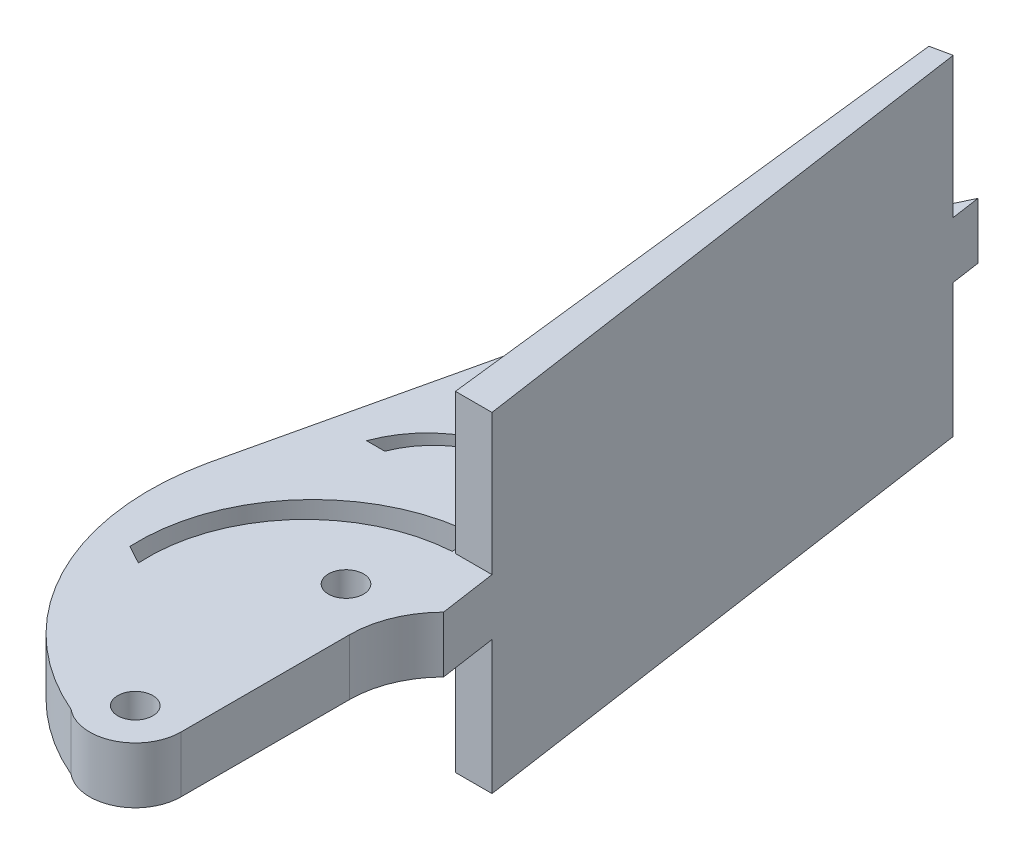
ISO-10303-21;
HEADER;
FILE_DESCRIPTION(('STEP AP214'),'2;1');
FILE_NAME('part.step','',(''),(''),'','','');
FILE_SCHEMA(('AUTOMOTIVE_DESIGN { 1 0 10303 214 1 1 1 1 }'));
ENDSEC;
DATA;
#1=APPLICATION_CONTEXT('core data for automotive mechanical design processes');
#2=APPLICATION_PROTOCOL_DEFINITION('international standard','automotive_design',2000,#1);
#3=PRODUCT_CONTEXT('',#1,'mechanical');
#4=PRODUCT('Part','Part','',(#3));
#5=PRODUCT_RELATED_PRODUCT_CATEGORY('part','',(#4));
#6=PRODUCT_DEFINITION_FORMATION('','',#4);
#7=PRODUCT_DEFINITION_CONTEXT('part definition',#1,'design');
#8=PRODUCT_DEFINITION('design','',#6,#7);
#9=PRODUCT_DEFINITION_SHAPE('','',#8);
#10=(LENGTH_UNIT() NAMED_UNIT(*) SI_UNIT(.MILLI.,.METRE.));
#11=(NAMED_UNIT(*) PLANE_ANGLE_UNIT() SI_UNIT($,.RADIAN.));
#12=(NAMED_UNIT(*) SI_UNIT($,.STERADIAN.) SOLID_ANGLE_UNIT());
#13=UNCERTAINTY_MEASURE_WITH_UNIT(LENGTH_MEASURE(1.E-05),#10,'distance_accuracy_value','');
#14=(GEOMETRIC_REPRESENTATION_CONTEXT(3) GLOBAL_UNCERTAINTY_ASSIGNED_CONTEXT((#13)) GLOBAL_UNIT_ASSIGNED_CONTEXT((#10,
#11,#12)) REPRESENTATION_CONTEXT('',''));
#15=CARTESIAN_POINT('',(0.,0.,0.));
#16=DIRECTION('',(0.,0.,1.));
#17=DIRECTION('',(1.,0.,0.));
#18=AXIS2_PLACEMENT_3D('',#15,#16,#17);
#19=CARTESIAN_POINT('',(0.,8.,0.));
#20=DIRECTION('',(0.,1.,0.));
#21=DIRECTION('',(0.,0.,1.));
#22=AXIS2_PLACEMENT_3D('',#19,#20,#21);
#23=PLANE('',#22);
#24=DIRECTION('',(-0.978459554748737,0.,0.206438610053701));
#25=VECTOR('',#24,1.);
#26=CARTESIAN_POINT('',(-24.0015502182052,8.,-113.760435287156));
#27=LINE('',#26,#25);
#28=CARTESIAN_POINT('',(-1.96303717669751,8.,-118.41019314159));
#29=VERTEX_POINT('',#28);
#30=CARTESIAN_POINT('',(-4.81941772703187,8.,-117.807544592926));
#31=VERTEX_POINT('',#30);
#32=EDGE_CURVE('E282',#29,#31,#27,.T.);
#33=ORIENTED_EDGE('',*,*,#32,.F.);
#34=DIRECTION('',(-0.144149943220239,0.,-0.989555856871961));
#35=VECTOR('',#34,1.);
#36=CARTESIAN_POINT('',(10.4081466808244,8.,-33.4848912706989));
#37=LINE('',#36,#35);
#38=CARTESIAN_POINT('',(-2.56534820899716,8.,-122.544918389175));
#39=VERTEX_POINT('',#38);
#40=EDGE_CURVE('E414',#29,#39,#37,.T.);
#41=ORIENTED_EDGE('',*,*,#40,.T.);
#42=DIRECTION('',(-0.429650341746804,0.,0.902995339875491));
#43=VECTOR('',#42,1.);
#44=CARTESIAN_POINT('',(-6.50000000000001,8.,-114.275467894005));
#45=LINE('',#44,#43);
#46=EDGE_CURVE('E419',#39,#31,#45,.T.);
#47=ORIENTED_EDGE('',*,*,#46,.T.);
#48=EDGE_LOOP('',(#33,#41,#47));
#49=FACE_BOUND('',#48,.T.);
#50=ADVANCED_FACE('F35',(#49),#23,.T.);
#51=CARTESIAN_POINT('',(0.,0.,0.));
#52=DIRECTION('',(0.,1.,0.));
#53=DIRECTION('',(0.,0.,1.));
#54=AXIS2_PLACEMENT_3D('',#51,#52,#53);
#55=PLANE('',#54);
#56=DIRECTION('',(-0.144149943220239,0.,-0.989555856871961));
#57=VECTOR('',#56,1.);
#58=CARTESIAN_POINT('',(10.4081466808244,0.,-33.4848912706989));
#59=LINE('',#58,#57);
#60=CARTESIAN_POINT('',(-1.96303717669751,0.,-118.41019314159));
#61=VERTEX_POINT('',#60);
#62=CARTESIAN_POINT('',(-2.56534820899716,0.,-122.544918389175));
#63=VERTEX_POINT('',#62);
#64=EDGE_CURVE('E428',#61,#63,#59,.T.);
#65=ORIENTED_EDGE('',*,*,#64,.F.);
#66=DIRECTION('',(-0.978459554748737,0.,0.206438610053701));
#67=VECTOR('',#66,1.);
#68=CARTESIAN_POINT('',(-24.0015502182052,0.,-113.760435287156));
#69=LINE('',#68,#67);
#70=CARTESIAN_POINT('',(-4.81941772703187,0.,-117.807544592926));
#71=VERTEX_POINT('',#70);
#72=EDGE_CURVE('E279',#61,#71,#69,.T.);
#73=ORIENTED_EDGE('',*,*,#72,.T.);
#74=DIRECTION('',(-0.429650341746804,0.,0.902995339875491));
#75=VECTOR('',#74,1.);
#76=CARTESIAN_POINT('',(-6.50000000000001,0.,-114.275467894005));
#77=LINE('',#76,#75);
#78=EDGE_CURVE('E410',#63,#71,#77,.T.);
#79=ORIENTED_EDGE('',*,*,#78,.F.);
#80=EDGE_LOOP('',(#65,#73,#79));
#81=FACE_BOUND('',#80,.T.);
#82=ADVANCED_FACE('F491',(#81),#55,.F.);
#83=DIRECTION('',(0.115307582744501,0.,0.993329835131121));
#84=VECTOR('',#83,1.);
#85=CARTESIAN_POINT('',(8.73815546155936,8.,-1.01434140834506));
#86=LINE('',#85,#84);
#87=CARTESIAN_POINT('',(-0.370262024287878,8.,-79.4798041660711));
#88=VERTEX_POINT('',#87);
#89=EDGE_CURVE('E50',#31,#88,#86,.T.);
#90=ORIENTED_EDGE('',*,*,#89,.F.);
#91=CARTESIAN_POINT('',(-6.50000000000001,8.,-114.275467894005));
#92=VERTEX_POINT('',#91);
#93=EDGE_CURVE('E418',#31,#92,#45,.T.);
#94=ORIENTED_EDGE('',*,*,#93,.T.);
#95=DIRECTION('',(0.224714099876424,0.,-0.97442473968836));
#96=VECTOR('',#95,1.);
#97=CARTESIAN_POINT('',(-31.1943271224295,8.,-7.19378814500271));
#98=LINE('',#97,#96);
#99=CARTESIAN_POINT('',(-24.7616449541148,8.,-35.0877416210196));
#100=VERTEX_POINT('',#99);
#101=EDGE_CURVE('E382',#100,#92,#98,.T.);
#102=ORIENTED_EDGE('',*,*,#101,.F.);
#103=CARTESIAN_POINT('',(9.87179029031433,8.,-27.5432388975849));
#104=DIRECTION('',(0.,-1.,0.));
#105=DIRECTION('',(0.,0.,-1.));
#106=AXIS2_PLACEMENT_3D('',#103,#104,#105);
#107=CIRCLE('',#106,35.4456535864975);
#108=CARTESIAN_POINT('',(-4.12894205869151,8.,5.02014317285557));
#109=VERTEX_POINT('',#108);
#110=EDGE_CURVE('E379',#109,#100,#107,.T.);
#111=ORIENTED_EDGE('',*,*,#110,.F.);
#112=CARTESIAN_POINT('',(0.,8.,0.));
#113=DIRECTION('',(0.,1.,0.));
#114=DIRECTION('',(0.,0.,1.));
#115=AXIS2_PLACEMENT_3D('',#112,#113,#114);
#116=CIRCLE('',#115,6.50000000000001);
#117=CARTESIAN_POINT('',(6.50000000000001,8.,0.));
#118=VERTEX_POINT('',#117);
#119=EDGE_CURVE('E407',#109,#118,#116,.T.);
#120=ORIENTED_EDGE('',*,*,#119,.T.);
#121=DIRECTION('',(0.,0.,-1.));
#122=VECTOR('',#121,1.);
#123=CARTESIAN_POINT('',(6.50000000000001,8.,0.));
#124=LINE('',#123,#122);
#125=CARTESIAN_POINT('',(6.50000000000001,8.,-24.));
#126=VERTEX_POINT('',#125);
#127=EDGE_CURVE('E409',#118,#126,#124,.T.);
#128=ORIENTED_EDGE('',*,*,#127,.T.);
#129=CARTESIAN_POINT('',(19.9637695934202,8.,-24.));
#130=DIRECTION('',(0.,-1.,0.));
#131=DIRECTION('',(0.,0.,1.));
#132=AXIS2_PLACEMENT_3D('',#129,#130,#131);
#133=CIRCLE('',#132,13.4637695934202);
#134=CARTESIAN_POINT('',(10.4081466808244,8.,-33.4848912706989));
#135=VERTEX_POINT('',#134);
#136=EDGE_CURVE('E412',#126,#135,#133,.T.);
#137=ORIENTED_EDGE('',*,*,#136,.T.);
#138=CARTESIAN_POINT('',(9.23319664539529,8.,-41.5506501819903));
#139=VERTEX_POINT('',#138);
#140=EDGE_CURVE('E415',#135,#139,#37,.T.);
#141=ORIENTED_EDGE('',*,*,#140,.T.);
#142=DIRECTION('',(1.,0.,0.));
#143=VECTOR('',#142,1.);
#144=CARTESIAN_POINT('',(0.,8.,-41.5506501819903));
#145=LINE('',#144,#143);
#146=CARTESIAN_POINT('',(4.0326250196425,8.,-41.5506501819903));
#147=VERTEX_POINT('',#146);
#148=EDGE_CURVE('E285',#147,#139,#145,.T.);
#149=ORIENTED_EDGE('',*,*,#148,.F.);
#150=CARTESIAN_POINT('',(0.,8.,-76.2901412940625));
#151=VERTEX_POINT('',#150);
#152=EDGE_CURVE('E276',#151,#147,#86,.T.);
#153=ORIENTED_EDGE('',*,*,#152,.F.);
#154=DIRECTION('',(0.,0.,1.));
#155=VECTOR('',#154,1.);
#156=CARTESIAN_POINT('',(0.,8.,-76.0414835697318));
#157=LINE('',#156,#155);
#158=CARTESIAN_POINT('',(0.,8.,-76.0414835697318));
#159=VERTEX_POINT('',#158);
#160=EDGE_CURVE('E296',#151,#159,#157,.T.);
#161=ORIENTED_EDGE('',*,*,#160,.T.);
#162=CARTESIAN_POINT('',(-2.60982967736821,8.,-67.2837094702245));
#163=DIRECTION('',(0.,1.,0.));
#164=DIRECTION('',(0.,0.,-1.));
#165=AXIS2_PLACEMENT_3D('',#162,#163,#164);
#166=CIRCLE('',#165,9.13837064923901);
#167=CARTESIAN_POINT('',(-11.3676037768755,8.,-69.8935391475928));
#168=VERTEX_POINT('',#167);
#169=EDGE_CURVE('E288',#159,#168,#166,.T.);
#170=ORIENTED_EDGE('',*,*,#169,.T.);
#171=DIRECTION('',(-0.889224485625051,0.,-0.457471107464574));
#172=VECTOR('',#171,1.);
#173=CARTESIAN_POINT('',(-11.3676037768755,8.,-69.8935391475928));
#174=LINE('',#173,#172);
#175=CARTESIAN_POINT('',(-13.0754520671843,8.,-70.7721600823277));
#176=VERTEX_POINT('',#175);
#177=EDGE_CURVE('E291',#168,#176,#174,.T.);
#178=ORIENTED_EDGE('',*,*,#177,.T.);
#179=CARTESIAN_POINT('',(-2.21846596166484,8.,-68.5536941206628));
#180=DIRECTION('',(0.,-1.,0.));
#181=DIRECTION('',(0.,0.,-1.));
#182=AXIS2_PLACEMENT_3D('',#179,#180,#181);
#183=CIRCLE('',#182,11.0813238612771);
#184=EDGE_CURVE('E56',#176,#88,#183,.T.);
#185=ORIENTED_EDGE('',*,*,#184,.T.);
#186=EDGE_LOOP('',(#90,#94,#102,#111,#120,#128,#137,#141,#149,#153,#161,#170,#178,#185));
#187=FACE_BOUND('',#186,.T.);
#188=CARTESIAN_POINT('',(-2.73478557009453,8.,-44.2838354653965));
#189=DIRECTION('',(0.,-1.,0.));
#190=DIRECTION('',(0.,0.,-1.));
#191=AXIS2_PLACEMENT_3D('',#188,#189,#190);
#192=CIRCLE('',#191,14.3185885992343);
#193=CARTESIAN_POINT('',(-16.2069395500168,8.,-49.1338918171706));
#194=VERTEX_POINT('',#193);
#195=CARTESIAN_POINT('',(2.11527078167961,8.,-57.7559894453188));
#196=VERTEX_POINT('',#195);
#197=EDGE_CURVE('E315',#194,#196,#192,.T.);
#198=ORIENTED_EDGE('',*,*,#197,.T.);
#199=DIRECTION('',(0.,0.,1.));
#200=VECTOR('',#199,1.);
#201=CARTESIAN_POINT('',(2.11527078167961,8.,-56.050896344864));
#202=LINE('',#201,#200);
#203=CARTESIAN_POINT('',(2.11527078167961,8.,-56.050896344864));
#204=VERTEX_POINT('',#203);
#205=EDGE_CURVE('E318',#196,#204,#202,.T.);
#206=ORIENTED_EDGE('',*,*,#205,.T.);
#207=CARTESIAN_POINT('',(-2.29245609918748,8.,-44.7261649363035));
#208=DIRECTION('',(0.,1.,0.));
#209=DIRECTION('',(0.,0.,-1.));
#210=AXIS2_PLACEMENT_3D('',#207,#208,#209);
#211=CIRCLE('',#210,12.1522671848654);
#212=CARTESIAN_POINT('',(-13.617187507748,8.,-49.1338918171706));
#213=VERTEX_POINT('',#212);
#214=EDGE_CURVE('E322',#204,#213,#211,.T.);
#215=ORIENTED_EDGE('',*,*,#214,.T.);
#216=DIRECTION('',(-1.,0.,0.));
#217=VECTOR('',#216,1.);
#218=CARTESIAN_POINT('',(-13.617187507748,8.,-49.1338918171706));
#219=LINE('',#218,#217);
#220=EDGE_CURVE('E325',#213,#194,#219,.T.);
#221=ORIENTED_EDGE('',*,*,#220,.T.);
#222=EDGE_LOOP('',(#198,#206,#215,#221));
#223=FACE_BOUND('',#222,.T.);
#224=CARTESIAN_POINT('',(4.96378659570352,8.,-19.2513719507803));
#225=DIRECTION('',(0.,1.,0.));
#226=DIRECTION('',(0.,0.,-1.));
#227=AXIS2_PLACEMENT_3D('',#224,#225,#226);
#228=CIRCLE('',#227,22.3800941443473);
#229=CARTESIAN_POINT('',(3.52847947186341,8.,-41.585393249465));
#230=VERTEX_POINT('',#229);
#231=CARTESIAN_POINT('',(-17.3702347029812,8.,-17.8160648269405));
#232=VERTEX_POINT('',#231);
#233=EDGE_CURVE('E347',#230,#232,#228,.T.);
#234=ORIENTED_EDGE('',*,*,#233,.T.);
#235=DIRECTION('',(-0.879505566908424,0.,-0.475888598074268));
#236=VECTOR('',#235,1.);
#237=CARTESIAN_POINT('',(-17.3702347029812,8.,-17.8160648269405));
#238=LINE('',#237,#236);
#239=CARTESIAN_POINT('',(-20.0228735994556,8.,-19.2513719507803));
#240=VERTEX_POINT('',#239);
#241=EDGE_CURVE('E350',#232,#240,#238,.T.);
#242=ORIENTED_EDGE('',*,*,#241,.T.);
#243=CARTESIAN_POINT('',(4.78114441918071,8.,-20.5040368980973));
#244=DIRECTION('',(0.,-1.,0.));
#245=DIRECTION('',(0.,0.,-1.));
#246=AXIS2_PLACEMENT_3D('',#243,#244,#245);
#247=CIRCLE('',#246,24.8356292317926);
#248=CARTESIAN_POINT('',(3.5284794718634,8.,-45.3080549167336));
#249=VERTEX_POINT('',#248);
#250=EDGE_CURVE('E354',#240,#249,#247,.T.);
#251=ORIENTED_EDGE('',*,*,#250,.T.);
#252=DIRECTION('',(0.,0.,1.));
#253=VECTOR('',#252,1.);
#254=CARTESIAN_POINT('',(3.52847947186341,8.,-41.585393249465));
#255=LINE('',#254,#253);
#256=EDGE_CURVE('E357',#249,#230,#255,.T.);
#257=ORIENTED_EDGE('',*,*,#256,.T.);
#258=EDGE_LOOP('',(#234,#242,#251,#257));
#259=FACE_BOUND('',#258,.T.);
#260=CARTESIAN_POINT('',(0.,8.,0.));
#261=DIRECTION('',(0.,1.,0.));
#262=DIRECTION('',(0.,0.,1.));
#263=AXIS2_PLACEMENT_3D('',#260,#261,#262);
#264=CIRCLE('',#263,2.5);
#265=CARTESIAN_POINT('',(0.,8.,2.5));
#266=VERTEX_POINT('',#265);
#267=EDGE_CURVE('E401',#266,#266,#264,.T.);
#268=ORIENTED_EDGE('',*,*,#267,.F.);
#269=EDGE_LOOP('',(#268));
#270=FACE_BOUND('',#269,.T.);
#271=CARTESIAN_POINT('',(0.,8.,-30.));
#272=DIRECTION('',(0.,1.,0.));
#273=DIRECTION('',(0.,0.,1.));
#274=AXIS2_PLACEMENT_3D('',#271,#272,#273);
#275=CIRCLE('',#274,2.5);
#276=CARTESIAN_POINT('',(0.,8.,-27.5));
#277=VERTEX_POINT('',#276);
#278=EDGE_CURVE('E395',#277,#277,#275,.T.);
#279=ORIENTED_EDGE('',*,*,#278,.F.);
#280=EDGE_LOOP('',(#279));
#281=FACE_BOUND('',#280,.T.);
#282=ADVANCED_FACE('F471',(#187,#223,#259,#270,#281),#23,.T.);
#283=CARTESIAN_POINT('',(-6.50000000000001,0.,-114.275467894005));
#284=VERTEX_POINT('',#283);
#285=EDGE_CURVE('E432',#71,#284,#77,.T.);
#286=ORIENTED_EDGE('',*,*,#285,.F.);
#287=DIRECTION('',(0.115307582744501,0.,0.993329835131121));
#288=VECTOR('',#287,1.);
#289=CARTESIAN_POINT('',(8.73815546155936,0.,-1.01434140834506));
#290=LINE('',#289,#288);
#291=CARTESIAN_POINT('',(-0.370262024287878,0.,-79.4798041660711));
#292=VERTEX_POINT('',#291);
#293=EDGE_CURVE('E263',#71,#292,#290,.T.);
#294=ORIENTED_EDGE('',*,*,#293,.T.);
#295=CARTESIAN_POINT('',(-2.21846596166484,0.,-68.5536941206628));
#296=DIRECTION('',(0.,-1.,0.));
#297=DIRECTION('',(0.,0.,-1.));
#298=AXIS2_PLACEMENT_3D('',#295,#296,#297);
#299=CIRCLE('',#298,11.0813238612771);
#300=CARTESIAN_POINT('',(-13.0754520671843,0.,-70.7721600823277));
#301=VERTEX_POINT('',#300);
#302=EDGE_CURVE('E303',#301,#292,#299,.T.);
#303=ORIENTED_EDGE('',*,*,#302,.F.);
#304=DIRECTION('',(-0.889224485625051,0.,-0.457471107464574));
#305=VECTOR('',#304,1.);
#306=CARTESIAN_POINT('',(-11.3676037768755,0.,-69.8935391475928));
#307=LINE('',#306,#305);
#308=CARTESIAN_POINT('',(-11.3676037768755,0.,-69.8935391475928));
#309=VERTEX_POINT('',#308);
#310=EDGE_CURVE('E300',#309,#301,#307,.T.);
#311=ORIENTED_EDGE('',*,*,#310,.F.);
#312=CARTESIAN_POINT('',(-2.60982967736821,0.,-67.2837094702245));
#313=DIRECTION('',(0.,1.,0.));
#314=DIRECTION('',(0.,0.,-1.));
#315=AXIS2_PLACEMENT_3D('',#312,#313,#314);
#316=CIRCLE('',#315,9.13837064923901);
#317=CARTESIAN_POINT('',(0.,0.,-76.0414835697318));
#318=VERTEX_POINT('',#317);
#319=EDGE_CURVE('E287',#318,#309,#316,.T.);
#320=ORIENTED_EDGE('',*,*,#319,.F.);
#321=DIRECTION('',(0.,0.,1.));
#322=VECTOR('',#321,1.);
#323=CARTESIAN_POINT('',(0.,0.,-76.0414835697318));
#324=LINE('',#323,#322);
#325=CARTESIAN_POINT('',(0.,0.,-76.2901412940625));
#326=VERTEX_POINT('',#325);
#327=EDGE_CURVE('E292',#326,#318,#324,.T.);
#328=ORIENTED_EDGE('',*,*,#327,.F.);
#329=CARTESIAN_POINT('',(4.0326250196425,0.,-41.5506501819903));
#330=VERTEX_POINT('',#329);
#331=EDGE_CURVE('E273',#326,#330,#290,.T.);
#332=ORIENTED_EDGE('',*,*,#331,.T.);
#333=DIRECTION('',(1.,0.,0.));
#334=VECTOR('',#333,1.);
#335=CARTESIAN_POINT('',(0.,0.,-41.5506501819903));
#336=LINE('',#335,#334);
#337=CARTESIAN_POINT('',(9.23319664539529,0.,-41.5506501819903));
#338=VERTEX_POINT('',#337);
#339=EDGE_CURVE('E226',#330,#338,#336,.T.);
#340=ORIENTED_EDGE('',*,*,#339,.T.);
#341=CARTESIAN_POINT('',(10.4081466808244,0.,-33.4848912706989));
#342=VERTEX_POINT('',#341);
#343=EDGE_CURVE('E429',#342,#338,#59,.T.);
#344=ORIENTED_EDGE('',*,*,#343,.F.);
#345=CARTESIAN_POINT('',(19.9637695934202,0.,-24.));
#346=DIRECTION('',(0.,-1.,0.));
#347=DIRECTION('',(0.,0.,1.));
#348=AXIS2_PLACEMENT_3D('',#345,#346,#347);
#349=CIRCLE('',#348,13.4637695934202);
#350=CARTESIAN_POINT('',(6.50000000000001,0.,-24.));
#351=VERTEX_POINT('',#350);
#352=EDGE_CURVE('E426',#351,#342,#349,.T.);
#353=ORIENTED_EDGE('',*,*,#352,.F.);
#354=DIRECTION('',(0.,0.,-1.));
#355=VECTOR('',#354,1.);
#356=CARTESIAN_POINT('',(6.50000000000001,0.,0.));
#357=LINE('',#356,#355);
#358=CARTESIAN_POINT('',(6.50000000000001,0.,0.));
#359=VERTEX_POINT('',#358);
#360=EDGE_CURVE('E424',#359,#351,#357,.T.);
#361=ORIENTED_EDGE('',*,*,#360,.F.);
#362=CARTESIAN_POINT('',(0.,0.,0.));
#363=DIRECTION('',(0.,1.,0.));
#364=DIRECTION('',(0.,0.,1.));
#365=AXIS2_PLACEMENT_3D('',#362,#363,#364);
#366=CIRCLE('',#365,6.50000000000001);
#367=CARTESIAN_POINT('',(-4.12894205869151,0.,5.02014317285557));
#368=VERTEX_POINT('',#367);
#369=EDGE_CURVE('E404',#368,#359,#366,.T.);
#370=ORIENTED_EDGE('',*,*,#369,.F.);
#371=CARTESIAN_POINT('',(9.87179029031433,0.,-27.5432388975849));
#372=DIRECTION('',(0.,-1.,0.));
#373=DIRECTION('',(0.,0.,-1.));
#374=AXIS2_PLACEMENT_3D('',#371,#372,#373);
#375=CIRCLE('',#374,35.4456535864975);
#376=CARTESIAN_POINT('',(-24.7616449541148,0.,-35.0877416210196));
#377=VERTEX_POINT('',#376);
#378=EDGE_CURVE('E372',#368,#377,#375,.T.);
#379=ORIENTED_EDGE('',*,*,#378,.T.);
#380=DIRECTION('',(0.224714099876424,0.,-0.97442473968836));
#381=VECTOR('',#380,1.);
#382=CARTESIAN_POINT('',(-31.1943271224295,0.,-7.19378814500271));
#383=LINE('',#382,#381);
#384=EDGE_CURVE('E383',#377,#284,#383,.T.);
#385=ORIENTED_EDGE('',*,*,#384,.T.);
#386=EDGE_LOOP('',(#286,#294,#303,#311,#320,#328,#332,#340,#344,#353,#361,#370,#379,#385));
#387=FACE_BOUND('',#386,.T.);
#388=DIRECTION('',(0.,0.,1.));
#389=VECTOR('',#388,1.);
#390=CARTESIAN_POINT('',(2.11527078167961,0.,-56.050896344864));
#391=LINE('',#390,#389);
#392=CARTESIAN_POINT('',(2.11527078167961,0.,-57.7559894453188));
#393=VERTEX_POINT('',#392);
#394=CARTESIAN_POINT('',(2.11527078167961,0.,-56.050896344864));
#395=VERTEX_POINT('',#394);
#396=EDGE_CURVE('E330',#393,#395,#391,.T.);
#397=ORIENTED_EDGE('',*,*,#396,.F.);
#398=CARTESIAN_POINT('',(-2.73478557009453,0.,-44.2838354653965));
#399=DIRECTION('',(0.,-1.,0.));
#400=DIRECTION('',(0.,0.,-1.));
#401=AXIS2_PLACEMENT_3D('',#398,#399,#400);
#402=CIRCLE('',#401,14.3185885992343);
#403=CARTESIAN_POINT('',(-16.2069395500168,0.,-49.1338918171706));
#404=VERTEX_POINT('',#403);
#405=EDGE_CURVE('E310',#404,#393,#402,.T.);
#406=ORIENTED_EDGE('',*,*,#405,.F.);
#407=DIRECTION('',(-1.,0.,0.));
#408=VECTOR('',#407,1.);
#409=CARTESIAN_POINT('',(-13.617187507748,0.,-49.1338918171706));
#410=LINE('',#409,#408);
#411=CARTESIAN_POINT('',(-13.617187507748,0.,-49.1338918171706));
#412=VERTEX_POINT('',#411);
#413=EDGE_CURVE('E319',#412,#404,#410,.T.);
#414=ORIENTED_EDGE('',*,*,#413,.F.);
#415=CARTESIAN_POINT('',(-2.29245609918748,0.,-44.7261649363035));
#416=DIRECTION('',(0.,1.,0.));
#417=DIRECTION('',(0.,0.,-1.));
#418=AXIS2_PLACEMENT_3D('',#415,#416,#417);
#419=CIRCLE('',#418,12.1522671848654);
#420=EDGE_CURVE('E333',#395,#412,#419,.T.);
#421=ORIENTED_EDGE('',*,*,#420,.F.);
#422=EDGE_LOOP('',(#397,#406,#414,#421));
#423=FACE_BOUND('',#422,.T.);
#424=DIRECTION('',(-0.879505566908424,0.,-0.475888598074268));
#425=VECTOR('',#424,1.);
#426=CARTESIAN_POINT('',(-17.3702347029812,0.,-17.8160648269405));
#427=LINE('',#426,#425);
#428=CARTESIAN_POINT('',(-17.3702347029812,0.,-17.8160648269405));
#429=VERTEX_POINT('',#428);
#430=CARTESIAN_POINT('',(-20.0228735994556,0.,-19.2513719507803));
#431=VERTEX_POINT('',#430);
#432=EDGE_CURVE('E362',#429,#431,#427,.T.);
#433=ORIENTED_EDGE('',*,*,#432,.F.);
#434=CARTESIAN_POINT('',(4.96378659570352,0.,-19.2513719507803));
#435=DIRECTION('',(0.,1.,0.));
#436=DIRECTION('',(0.,0.,-1.));
#437=AXIS2_PLACEMENT_3D('',#434,#435,#436);
#438=CIRCLE('',#437,22.3800941443473);
#439=CARTESIAN_POINT('',(3.52847947186341,0.,-41.585393249465));
#440=VERTEX_POINT('',#439);
#441=EDGE_CURVE('E340',#440,#429,#438,.T.);
#442=ORIENTED_EDGE('',*,*,#441,.F.);
#443=DIRECTION('',(0.,0.,1.));
#444=VECTOR('',#443,1.);
#445=CARTESIAN_POINT('',(3.52847947186341,0.,-41.585393249465));
#446=LINE('',#445,#444);
#447=CARTESIAN_POINT('',(3.5284794718634,0.,-45.3080549167336));
#448=VERTEX_POINT('',#447);
#449=EDGE_CURVE('E351',#448,#440,#446,.T.);
#450=ORIENTED_EDGE('',*,*,#449,.F.);
#451=CARTESIAN_POINT('',(4.78114441918071,0.,-20.5040368980973));
#452=DIRECTION('',(0.,-1.,0.));
#453=DIRECTION('',(0.,0.,-1.));
#454=AXIS2_PLACEMENT_3D('',#451,#452,#453);
#455=CIRCLE('',#454,24.8356292317926);
#456=EDGE_CURVE('E365',#431,#448,#455,.T.);
#457=ORIENTED_EDGE('',*,*,#456,.F.);
#458=EDGE_LOOP('',(#433,#442,#450,#457));
#459=FACE_BOUND('',#458,.T.);
#460=CARTESIAN_POINT('',(0.,0.,0.));
#461=DIRECTION('',(0.,1.,0.));
#462=DIRECTION('',(0.,0.,1.));
#463=AXIS2_PLACEMENT_3D('',#460,#461,#462);
#464=CIRCLE('',#463,2.5);
#465=CARTESIAN_POINT('',(0.,0.,2.5));
#466=VERTEX_POINT('',#465);
#467=EDGE_CURVE('E398',#466,#466,#464,.T.);
#468=ORIENTED_EDGE('',*,*,#467,.T.);
#469=EDGE_LOOP('',(#468));
#470=FACE_BOUND('',#469,.T.);
#471=CARTESIAN_POINT('',(0.,0.,-30.));
#472=DIRECTION('',(0.,1.,0.));
#473=DIRECTION('',(0.,0.,1.));
#474=AXIS2_PLACEMENT_3D('',#471,#472,#473);
#475=CIRCLE('',#474,2.5);
#476=CARTESIAN_POINT('',(0.,0.,-27.5));
#477=VERTEX_POINT('',#476);
#478=EDGE_CURVE('E393',#477,#477,#475,.T.);
#479=ORIENTED_EDGE('',*,*,#478,.T.);
#480=EDGE_LOOP('',(#479));
#481=FACE_BOUND('',#480,.T.);
#482=ADVANCED_FACE('F457',(#387,#423,#459,#470,#481),#55,.F.);
#483=CARTESIAN_POINT('',(0.,8.,0.));
#484=DIRECTION('',(0.,-1.,0.));
#485=DIRECTION('',(0.,0.,-1.));
#486=AXIS2_PLACEMENT_3D('',#483,#484,#485);
#487=CYLINDRICAL_SURFACE('',#486,6.50000000000001);
#488=ORIENTED_EDGE('',*,*,#119,.F.);
#489=DIRECTION('',(0.,-1.,0.));
#490=VECTOR('',#489,1.);
#491=CARTESIAN_POINT('',(-4.12894205869151,8.,5.02014317285557));
#492=LINE('',#491,#490);
#493=EDGE_CURVE('E386',#109,#368,#492,.T.);
#494=ORIENTED_EDGE('',*,*,#493,.T.);
#495=ORIENTED_EDGE('',*,*,#369,.T.);
#496=DIRECTION('',(0.,-1.,0.));
#497=VECTOR('',#496,1.);
#498=CARTESIAN_POINT('',(6.50000000000001,8.,0.));
#499=LINE('',#498,#497);
#500=EDGE_CURVE('E43',#118,#359,#499,.T.);
#501=ORIENTED_EDGE('',*,*,#500,.F.);
#502=EDGE_LOOP('',(#488,#494,#495,#501));
#503=FACE_BOUND('',#502,.T.);
#504=ADVANCED_FACE('F37',(#503),#487,.T.);
#505=CARTESIAN_POINT('',(6.50000000000001,8.,0.));
#506=DIRECTION('',(-1.,0.,0.));
#507=DIRECTION('',(0.,0.,1.));
#508=AXIS2_PLACEMENT_3D('',#505,#506,#507);
#509=PLANE('',#508);
#510=ORIENTED_EDGE('',*,*,#360,.T.);
#511=DIRECTION('',(0.,-1.,0.));
#512=VECTOR('',#511,1.);
#513=CARTESIAN_POINT('',(6.50000000000001,8.,-24.));
#514=LINE('',#513,#512);
#515=EDGE_CURVE('E443',#126,#351,#514,.T.);
#516=ORIENTED_EDGE('',*,*,#515,.F.);
#517=ORIENTED_EDGE('',*,*,#127,.F.);
#518=ORIENTED_EDGE('',*,*,#500,.T.);
#519=EDGE_LOOP('',(#510,#516,#517,#518));
#520=FACE_BOUND('',#519,.T.);
#521=ADVANCED_FACE('F450',(#520),#509,.F.);
#522=CARTESIAN_POINT('',(19.9637695934202,8.,-24.));
#523=DIRECTION('',(0.,-1.,0.));
#524=DIRECTION('',(0.,0.,-1.));
#525=AXIS2_PLACEMENT_3D('',#522,#523,#524);
#526=CYLINDRICAL_SURFACE('',#525,13.4637695934202);
#527=ORIENTED_EDGE('',*,*,#352,.T.);
#528=DIRECTION('',(0.,-1.,0.));
#529=VECTOR('',#528,1.);
#530=CARTESIAN_POINT('',(10.4081466808244,8.,-33.4848912706989));
#531=LINE('',#530,#529);
#532=EDGE_CURVE('E440',#135,#342,#531,.T.);
#533=ORIENTED_EDGE('',*,*,#532,.F.);
#534=ORIENTED_EDGE('',*,*,#136,.F.);
#535=ORIENTED_EDGE('',*,*,#515,.T.);
#536=EDGE_LOOP('',(#527,#533,#534,#535));
#537=FACE_BOUND('',#536,.T.);
#538=ADVANCED_FACE('F463',(#537),#526,.F.);
#539=CARTESIAN_POINT('',(10.4081466808244,8.,-33.4848912706989));
#540=DIRECTION('',(-0.989555856871961,0.,0.144149943220239));
#541=DIRECTION('',(0.144149943220239,0.,0.989555856871961));
#542=AXIS2_PLACEMENT_3D('',#539,#540,#541);
#543=PLANE('',#542);
#544=ORIENTED_EDGE('',*,*,#40,.F.);
#545=DIRECTION('',(0.,-1.,0.));
#546=VECTOR('',#545,1.);
#547=CARTESIAN_POINT('',(-1.96303717669751,28.,-118.41019314159));
#548=LINE('',#547,#546);
#549=CARTESIAN_POINT('',(-1.96303717669751,28.,-118.41019314159));
#550=VERTEX_POINT('',#549);
#551=EDGE_CURVE('E265',#550,#29,#548,.T.);
#552=ORIENTED_EDGE('',*,*,#551,.F.);
#553=DIRECTION('',(0.14414994322024,0.,0.989555856871961));
#554=VECTOR('',#553,1.);
#555=CARTESIAN_POINT('',(9.23319664539529,28.,-41.5506501819903));
#556=LINE('',#555,#554);
#557=CARTESIAN_POINT('',(9.23319664539529,28.,-41.5506501819903));
#558=VERTEX_POINT('',#557);
#559=EDGE_CURVE('E229',#550,#558,#556,.T.);
#560=ORIENTED_EDGE('',*,*,#559,.T.);
#561=DIRECTION('',(0.,-1.,0.));
#562=VECTOR('',#561,1.);
#563=CARTESIAN_POINT('',(9.23319664539529,28.,-41.5506501819903));
#564=LINE('',#563,#562);
#565=EDGE_CURVE('E260',#558,#139,#564,.T.);
#566=ORIENTED_EDGE('',*,*,#565,.T.);
#567=ORIENTED_EDGE('',*,*,#140,.F.);
#568=ORIENTED_EDGE('',*,*,#532,.T.);
#569=ORIENTED_EDGE('',*,*,#343,.T.);
#570=CARTESIAN_POINT('',(9.23319664539529,-19.,-41.5506501819903));
#571=VERTEX_POINT('',#570);
#572=EDGE_CURVE('E264',#338,#571,#564,.T.);
#573=ORIENTED_EDGE('',*,*,#572,.T.);
#574=DIRECTION('',(0.14414994322024,0.,0.989555856871961));
#575=VECTOR('',#574,1.);
#576=CARTESIAN_POINT('',(9.23319664539529,-19.,-41.5506501819903));
#577=LINE('',#576,#575);
#578=CARTESIAN_POINT('',(-1.96303717669751,-19.,-118.41019314159));
#579=VERTEX_POINT('',#578);
#580=EDGE_CURVE('E244',#579,#571,#577,.T.);
#581=ORIENTED_EDGE('',*,*,#580,.F.);
#582=EDGE_CURVE('E267',#61,#579,#548,.T.);
#583=ORIENTED_EDGE('',*,*,#582,.F.);
#584=ORIENTED_EDGE('',*,*,#64,.T.);
#585=DIRECTION('',(0.,-1.,0.));
#586=VECTOR('',#585,1.);
#587=CARTESIAN_POINT('',(-2.56534820899716,8.,-122.544918389175));
#588=LINE('',#587,#586);
#589=EDGE_CURVE('E437',#39,#63,#588,.T.);
#590=ORIENTED_EDGE('',*,*,#589,.F.);
#591=EDGE_LOOP('',(#544,#552,#560,#566,#567,#568,#569,#573,#581,#583,#584,#590));
#592=FACE_BOUND('',#591,.T.);
#593=ADVANCED_FACE('F468',(#592),#543,.F.);
#594=CARTESIAN_POINT('',(-6.50000000000001,8.,-114.275467894005));
#595=DIRECTION('',(0.902995339875491,0.,0.429650341746805));
#596=DIRECTION('',(0.429650341746805,0.,-0.902995339875491));
#597=AXIS2_PLACEMENT_3D('',#594,#595,#596);
#598=PLANE('',#597);
#599=ORIENTED_EDGE('',*,*,#93,.F.);
#600=ORIENTED_EDGE('',*,*,#46,.F.);
#601=ORIENTED_EDGE('',*,*,#589,.T.);
#602=ORIENTED_EDGE('',*,*,#78,.T.);
#603=ORIENTED_EDGE('',*,*,#285,.T.);
#604=DIRECTION('',(0.,-1.,0.));
#605=VECTOR('',#604,1.);
#606=CARTESIAN_POINT('',(-6.50000000000001,8.,-114.275467894005));
#607=LINE('',#606,#605);
#608=EDGE_CURVE('E422',#92,#284,#607,.T.);
#609=ORIENTED_EDGE('',*,*,#608,.F.);
#610=EDGE_LOOP('',(#599,#600,#601,#602,#603,#609));
#611=FACE_BOUND('',#610,.T.);
#612=ADVANCED_FACE('F485',(#611),#598,.F.);
#613=CARTESIAN_POINT('',(0.,8.,0.));
#614=DIRECTION('',(0.,-1.,0.));
#615=DIRECTION('',(0.,0.,-1.));
#616=AXIS2_PLACEMENT_3D('',#613,#614,#615);
#617=CYLINDRICAL_SURFACE('',#616,2.5);
#618=ORIENTED_EDGE('',*,*,#267,.T.);
#619=EDGE_LOOP('',(#618));
#620=FACE_BOUND('',#619,.T.);
#621=ORIENTED_EDGE('',*,*,#467,.F.);
#622=EDGE_LOOP('',(#621));
#623=FACE_BOUND('',#622,.T.);
#624=ADVANCED_FACE('F551',(#620,#623),#617,.F.);
#625=CARTESIAN_POINT('',(0.,8.,-30.));
#626=DIRECTION('',(0.,-1.,0.));
#627=DIRECTION('',(0.,0.,-1.));
#628=AXIS2_PLACEMENT_3D('',#625,#626,#627);
#629=CYLINDRICAL_SURFACE('',#628,2.5);
#630=ORIENTED_EDGE('',*,*,#278,.T.);
#631=EDGE_LOOP('',(#630));
#632=FACE_BOUND('',#631,.T.);
#633=ORIENTED_EDGE('',*,*,#478,.F.);
#634=EDGE_LOOP('',(#633));
#635=FACE_BOUND('',#634,.T.);
#636=ADVANCED_FACE('F579',(#632,#635),#629,.F.);
#637=CARTESIAN_POINT('',(-31.1943271224295,8.,-7.19378814500271));
#638=DIRECTION('',(-0.97442473968836,0.,-0.224714099876424));
#639=DIRECTION('',(-0.224714099876424,0.,0.97442473968836));
#640=AXIS2_PLACEMENT_3D('',#637,#638,#639);
#641=PLANE('',#640);
#642=ORIENTED_EDGE('',*,*,#384,.F.);
#643=DIRECTION('',(0.,-1.,0.));
#644=VECTOR('',#643,1.);
#645=CARTESIAN_POINT('',(-24.7616449541148,8.,-35.0877416210196));
#646=LINE('',#645,#644);
#647=EDGE_CURVE('E391',#100,#377,#646,.T.);
#648=ORIENTED_EDGE('',*,*,#647,.F.);
#649=ORIENTED_EDGE('',*,*,#101,.T.);
#650=ORIENTED_EDGE('',*,*,#608,.T.);
#651=EDGE_LOOP('',(#642,#648,#649,#650));
#652=FACE_BOUND('',#651,.T.);
#653=ADVANCED_FACE('F481',(#652),#641,.T.);
#654=CARTESIAN_POINT('',(9.87179029031433,8.,-27.5432388975849));
#655=DIRECTION('',(0.,-1.,0.));
#656=DIRECTION('',(0.,0.,-1.));
#657=AXIS2_PLACEMENT_3D('',#654,#655,#656);
#658=CYLINDRICAL_SURFACE('',#657,35.4456535864975);
#659=ORIENTED_EDGE('',*,*,#378,.F.);
#660=ORIENTED_EDGE('',*,*,#493,.F.);
#661=ORIENTED_EDGE('',*,*,#110,.T.);
#662=ORIENTED_EDGE('',*,*,#647,.T.);
#663=EDGE_LOOP('',(#659,#660,#661,#662));
#664=FACE_BOUND('',#663,.T.);
#665=ADVANCED_FACE('F478',(#664),#658,.T.);
#666=CARTESIAN_POINT('',(4.96378659570352,8.,-19.2513719507803));
#667=DIRECTION('',(0.,-1.,0.));
#668=DIRECTION('',(0.,0.,-1.));
#669=AXIS2_PLACEMENT_3D('',#666,#667,#668);
#670=CYLINDRICAL_SURFACE('',#669,22.3800941443473);
#671=ORIENTED_EDGE('',*,*,#441,.T.);
#672=DIRECTION('',(0.,-1.,0.));
#673=VECTOR('',#672,1.);
#674=CARTESIAN_POINT('',(-17.3702347029812,8.,-17.8160648269405));
#675=LINE('',#674,#673);
#676=EDGE_CURVE('E360',#232,#429,#675,.T.);
#677=ORIENTED_EDGE('',*,*,#676,.F.);
#678=ORIENTED_EDGE('',*,*,#233,.F.);
#679=DIRECTION('',(0.,-1.,0.));
#680=VECTOR('',#679,1.);
#681=CARTESIAN_POINT('',(3.52847947186341,8.,-41.585393249465));
#682=LINE('',#681,#680);
#683=EDGE_CURVE('E370',#230,#440,#682,.T.);
#684=ORIENTED_EDGE('',*,*,#683,.T.);
#685=EDGE_LOOP('',(#671,#677,#678,#684));
#686=FACE_BOUND('',#685,.T.);
#687=ADVANCED_FACE('F608',(#686),#670,.T.);
#688=CARTESIAN_POINT('',(3.52847947186341,8.,-41.585393249465));
#689=DIRECTION('',(1.,0.,0.));
#690=DIRECTION('',(0.,0.,-1.));
#691=AXIS2_PLACEMENT_3D('',#688,#689,#690);
#692=PLANE('',#691);
#693=ORIENTED_EDGE('',*,*,#449,.T.);
#694=ORIENTED_EDGE('',*,*,#683,.F.);
#695=ORIENTED_EDGE('',*,*,#256,.F.);
#696=DIRECTION('',(0.,-1.,0.));
#697=VECTOR('',#696,1.);
#698=CARTESIAN_POINT('',(3.5284794718634,8.,-45.3080549167336));
#699=LINE('',#698,#697);
#700=EDGE_CURVE('E373',#249,#448,#699,.T.);
#701=ORIENTED_EDGE('',*,*,#700,.T.);
#702=EDGE_LOOP('',(#693,#694,#695,#701));
#703=FACE_BOUND('',#702,.T.);
#704=ADVANCED_FACE('F615',(#703),#692,.F.);
#705=CARTESIAN_POINT('',(4.78114441918071,8.,-20.5040368980973));
#706=DIRECTION('',(0.,-1.,0.));
#707=DIRECTION('',(0.,0.,-1.));
#708=AXIS2_PLACEMENT_3D('',#705,#706,#707);
#709=CYLINDRICAL_SURFACE('',#708,24.8356292317926);
#710=ORIENTED_EDGE('',*,*,#456,.T.);
#711=ORIENTED_EDGE('',*,*,#700,.F.);
#712=ORIENTED_EDGE('',*,*,#250,.F.);
#713=DIRECTION('',(0.,-1.,0.));
#714=VECTOR('',#713,1.);
#715=CARTESIAN_POINT('',(-20.0228735994556,8.,-19.2513719507803));
#716=LINE('',#715,#714);
#717=EDGE_CURVE('E375',#240,#431,#716,.T.);
#718=ORIENTED_EDGE('',*,*,#717,.T.);
#719=EDGE_LOOP('',(#710,#711,#712,#718));
#720=FACE_BOUND('',#719,.T.);
#721=ADVANCED_FACE('F623',(#720),#709,.F.);
#722=CARTESIAN_POINT('',(-17.3702347029812,8.,-17.8160648269405));
#723=DIRECTION('',(-0.475888598074268,0.,0.879505566908424));
#724=DIRECTION('',(0.879505566908424,0.,0.475888598074268));
#725=AXIS2_PLACEMENT_3D('',#722,#723,#724);
#726=PLANE('',#725);
#727=ORIENTED_EDGE('',*,*,#432,.T.);
#728=ORIENTED_EDGE('',*,*,#717,.F.);
#729=ORIENTED_EDGE('',*,*,#241,.F.);
#730=ORIENTED_EDGE('',*,*,#676,.T.);
#731=EDGE_LOOP('',(#727,#728,#729,#730));
#732=FACE_BOUND('',#731,.T.);
#733=ADVANCED_FACE('F631',(#732),#726,.F.);
#734=CARTESIAN_POINT('',(-2.73478557009453,8.,-44.2838354653965));
#735=DIRECTION('',(0.,-1.,0.));
#736=DIRECTION('',(0.,0.,-1.));
#737=AXIS2_PLACEMENT_3D('',#734,#735,#736);
#738=CYLINDRICAL_SURFACE('',#737,14.3185885992343);
#739=ORIENTED_EDGE('',*,*,#405,.T.);
#740=DIRECTION('',(0.,-1.,0.));
#741=VECTOR('',#740,1.);
#742=CARTESIAN_POINT('',(2.11527078167961,8.,-57.7559894453188));
#743=LINE('',#742,#741);
#744=EDGE_CURVE('E328',#196,#393,#743,.T.);
#745=ORIENTED_EDGE('',*,*,#744,.F.);
#746=ORIENTED_EDGE('',*,*,#197,.F.);
#747=DIRECTION('',(0.,-1.,0.));
#748=VECTOR('',#747,1.);
#749=CARTESIAN_POINT('',(-16.2069395500168,8.,-49.1338918171706));
#750=LINE('',#749,#748);
#751=EDGE_CURVE('E338',#194,#404,#750,.T.);
#752=ORIENTED_EDGE('',*,*,#751,.T.);
#753=EDGE_LOOP('',(#739,#745,#746,#752));
#754=FACE_BOUND('',#753,.T.);
#755=ADVANCED_FACE('F639',(#754),#738,.F.);
#756=CARTESIAN_POINT('',(-13.617187507748,8.,-49.1338918171706));
#757=DIRECTION('',(0.,0.,1.));
#758=DIRECTION('',(1.,0.,0.));
#759=AXIS2_PLACEMENT_3D('',#756,#757,#758);
#760=PLANE('',#759);
#761=ORIENTED_EDGE('',*,*,#413,.T.);
#762=ORIENTED_EDGE('',*,*,#751,.F.);
#763=ORIENTED_EDGE('',*,*,#220,.F.);
#764=DIRECTION('',(0.,-1.,0.));
#765=VECTOR('',#764,1.);
#766=CARTESIAN_POINT('',(-13.617187507748,8.,-49.1338918171706));
#767=LINE('',#766,#765);
#768=EDGE_CURVE('E341',#213,#412,#767,.T.);
#769=ORIENTED_EDGE('',*,*,#768,.T.);
#770=EDGE_LOOP('',(#761,#762,#763,#769));
#771=FACE_BOUND('',#770,.T.);
#772=ADVANCED_FACE('F647',(#771),#760,.F.);
#773=CARTESIAN_POINT('',(-2.29245609918748,8.,-44.7261649363035));
#774=DIRECTION('',(0.,-1.,0.));
#775=DIRECTION('',(0.,0.,-1.));
#776=AXIS2_PLACEMENT_3D('',#773,#774,#775);
#777=CYLINDRICAL_SURFACE('',#776,12.1522671848654);
#778=ORIENTED_EDGE('',*,*,#420,.T.);
#779=ORIENTED_EDGE('',*,*,#768,.F.);
#780=ORIENTED_EDGE('',*,*,#214,.F.);
#781=DIRECTION('',(0.,-1.,0.));
#782=VECTOR('',#781,1.);
#783=CARTESIAN_POINT('',(2.11527078167961,8.,-56.050896344864));
#784=LINE('',#783,#782);
#785=EDGE_CURVE('E343',#204,#395,#784,.T.);
#786=ORIENTED_EDGE('',*,*,#785,.T.);
#787=EDGE_LOOP('',(#778,#779,#780,#786));
#788=FACE_BOUND('',#787,.T.);
#789=ADVANCED_FACE('F655',(#788),#777,.T.);
#790=CARTESIAN_POINT('',(2.11527078167961,8.,-56.050896344864));
#791=DIRECTION('',(1.,0.,0.));
#792=DIRECTION('',(0.,0.,-1.));
#793=AXIS2_PLACEMENT_3D('',#790,#791,#792);
#794=PLANE('',#793);
#795=ORIENTED_EDGE('',*,*,#396,.T.);
#796=ORIENTED_EDGE('',*,*,#785,.F.);
#797=ORIENTED_EDGE('',*,*,#205,.F.);
#798=ORIENTED_EDGE('',*,*,#744,.T.);
#799=EDGE_LOOP('',(#795,#796,#797,#798));
#800=FACE_BOUND('',#799,.T.);
#801=ADVANCED_FACE('F529',(#800),#794,.F.);
#802=CARTESIAN_POINT('',(-2.60982967736821,8.,-67.2837094702245));
#803=DIRECTION('',(0.,-1.,0.));
#804=DIRECTION('',(0.,0.,-1.));
#805=AXIS2_PLACEMENT_3D('',#802,#803,#804);
#806=CYLINDRICAL_SURFACE('',#805,9.13837064923901);
#807=ORIENTED_EDGE('',*,*,#319,.T.);
#808=DIRECTION('',(0.,-1.,0.));
#809=VECTOR('',#808,1.);
#810=CARTESIAN_POINT('',(-11.3676037768755,8.,-69.8935391475928));
#811=LINE('',#810,#809);
#812=EDGE_CURVE('E298',#168,#309,#811,.T.);
#813=ORIENTED_EDGE('',*,*,#812,.F.);
#814=ORIENTED_EDGE('',*,*,#169,.F.);
#815=DIRECTION('',(0.,-1.,0.));
#816=VECTOR('',#815,1.);
#817=CARTESIAN_POINT('',(0.,8.,-76.0414835697318));
#818=LINE('',#817,#816);
#819=EDGE_CURVE('E307',#159,#318,#818,.T.);
#820=ORIENTED_EDGE('',*,*,#819,.T.);
#821=EDGE_LOOP('',(#807,#813,#814,#820));
#822=FACE_BOUND('',#821,.T.);
#823=ADVANCED_FACE('F517',(#822),#806,.T.);
#824=CARTESIAN_POINT('',(0.,8.,-76.0414835697318));
#825=DIRECTION('',(1.,0.,0.));
#826=DIRECTION('',(0.,0.,-1.));
#827=AXIS2_PLACEMENT_3D('',#824,#825,#826);
#828=PLANE('',#827);
#829=ORIENTED_EDGE('',*,*,#160,.F.);
#830=DIRECTION('',(0.,-1.,0.));
#831=VECTOR('',#830,1.);
#832=CARTESIAN_POINT('',(0.,8.,-76.2901412940625));
#833=LINE('',#832,#831);
#834=EDGE_CURVE('E275',#151,#326,#833,.T.);
#835=ORIENTED_EDGE('',*,*,#834,.T.);
#836=ORIENTED_EDGE('',*,*,#327,.T.);
#837=ORIENTED_EDGE('',*,*,#819,.F.);
#838=EDGE_LOOP('',(#829,#835,#836,#837));
#839=FACE_BOUND('',#838,.T.);
#840=ADVANCED_FACE('F520',(#839),#828,.F.);
#841=CARTESIAN_POINT('',(-2.21846596166484,8.,-68.5536941206628));
#842=DIRECTION('',(0.,-1.,0.));
#843=DIRECTION('',(0.,0.,-1.));
#844=AXIS2_PLACEMENT_3D('',#841,#842,#843);
#845=CYLINDRICAL_SURFACE('',#844,11.0813238612771);
#846=ORIENTED_EDGE('',*,*,#302,.T.);
#847=DIRECTION('',(0.,-1.,0.));
#848=VECTOR('',#847,1.);
#849=CARTESIAN_POINT('',(-0.370262024287878,8.,-79.4798041660711));
#850=LINE('',#849,#848);
#851=EDGE_CURVE('E11',#292,#88,#850,.F.);
#852=ORIENTED_EDGE('',*,*,#851,.T.);
#853=ORIENTED_EDGE('',*,*,#184,.F.);
#854=DIRECTION('',(0.,-1.,0.));
#855=VECTOR('',#854,1.);
#856=CARTESIAN_POINT('',(-13.0754520671843,8.,-70.7721600823277));
#857=LINE('',#856,#855);
#858=EDGE_CURVE('E311',#176,#301,#857,.T.);
#859=ORIENTED_EDGE('',*,*,#858,.T.);
#860=EDGE_LOOP('',(#846,#852,#853,#859));
#861=FACE_BOUND('',#860,.T.);
#862=ADVANCED_FACE('F515',(#861),#845,.F.);
#863=CARTESIAN_POINT('',(-11.3676037768755,8.,-69.8935391475928));
#864=DIRECTION('',(-0.457471107464574,0.,0.889224485625051));
#865=DIRECTION('',(0.889224485625051,0.,0.457471107464574));
#866=AXIS2_PLACEMENT_3D('',#863,#864,#865);
#867=PLANE('',#866);
#868=ORIENTED_EDGE('',*,*,#310,.T.);
#869=ORIENTED_EDGE('',*,*,#858,.F.);
#870=ORIENTED_EDGE('',*,*,#177,.F.);
#871=ORIENTED_EDGE('',*,*,#812,.T.);
#872=EDGE_LOOP('',(#868,#869,#870,#871));
#873=FACE_BOUND('',#872,.T.);
#874=ADVANCED_FACE('F512',(#873),#867,.F.);
#875=CARTESIAN_POINT('',(9.23319664539529,28.,-41.5506501819903));
#876=DIRECTION('',(0.,0.,1.));
#877=DIRECTION('',(1.,0.,0.));
#878=AXIS2_PLACEMENT_3D('',#875,#876,#877);
#879=PLANE('',#878);
#880=ORIENTED_EDGE('',*,*,#339,.F.);
#881=DIRECTION('',(0.,-1.,0.));
#882=VECTOR('',#881,1.);
#883=CARTESIAN_POINT('',(4.0326250196425,28.,-41.5506501819903));
#884=LINE('',#883,#882);
#885=CARTESIAN_POINT('',(4.0326250196425,-19.,-41.5506501819903));
#886=VERTEX_POINT('',#885);
#887=EDGE_CURVE('E220',#330,#886,#884,.T.);
#888=ORIENTED_EDGE('',*,*,#887,.T.);
#889=DIRECTION('',(-1.,0.,0.));
#890=VECTOR('',#889,1.);
#891=CARTESIAN_POINT('',(9.23319664539529,-19.,-41.5506501819903));
#892=LINE('',#891,#890);
#893=EDGE_CURVE('E224',#571,#886,#892,.T.);
#894=ORIENTED_EDGE('',*,*,#893,.F.);
#895=ORIENTED_EDGE('',*,*,#572,.F.);
#896=EDGE_LOOP('',(#880,#888,#894,#895));
#897=FACE_BOUND('',#896,.T.);
#898=ADVANCED_FACE('F222',(#897),#879,.T.);
#899=CARTESIAN_POINT('',(-4.81941772703187,28.,-117.807544592926));
#900=DIRECTION('',(-0.206438610053701,0.,-0.978459554748736));
#901=DIRECTION('',(-0.978459554748737,0.,0.206438610053701));
#902=AXIS2_PLACEMENT_3D('',#899,#900,#901);
#903=PLANE('',#902);
#904=ORIENTED_EDGE('',*,*,#72,.F.);
#905=ORIENTED_EDGE('',*,*,#582,.T.);
#906=DIRECTION('',(0.978459554748737,0.,-0.206438610053701));
#907=VECTOR('',#906,1.);
#908=CARTESIAN_POINT('',(-4.81941772703187,-19.,-117.807544592926));
#909=LINE('',#908,#907);
#910=CARTESIAN_POINT('',(-4.81941772703187,-19.,-117.807544592926));
#911=VERTEX_POINT('',#910);
#912=EDGE_CURVE('E239',#911,#579,#909,.T.);
#913=ORIENTED_EDGE('',*,*,#912,.F.);
#914=DIRECTION('',(0.,-1.,0.));
#915=VECTOR('',#914,1.);
#916=CARTESIAN_POINT('',(-4.81941772703187,28.,-117.807544592926));
#917=LINE('',#916,#915);
#918=EDGE_CURVE('E235',#71,#911,#917,.T.);
#919=ORIENTED_EDGE('',*,*,#918,.F.);
#920=EDGE_LOOP('',(#904,#905,#913,#919));
#921=FACE_BOUND('',#920,.T.);
#922=ADVANCED_FACE('F494',(#921),#903,.T.);
#923=CARTESIAN_POINT('',(4.0326250196425,28.,-41.5506501819903));
#924=VERTEX_POINT('',#923);
#925=EDGE_CURVE('E228',#924,#147,#884,.T.);
#926=ORIENTED_EDGE('',*,*,#925,.T.);
#927=ORIENTED_EDGE('',*,*,#148,.T.);
#928=ORIENTED_EDGE('',*,*,#565,.F.);
#929=DIRECTION('',(-1.,0.,0.));
#930=VECTOR('',#929,1.);
#931=CARTESIAN_POINT('',(9.23319664539529,28.,-41.5506501819903));
#932=LINE('',#931,#930);
#933=EDGE_CURVE('E249',#558,#924,#932,.T.);
#934=ORIENTED_EDGE('',*,*,#933,.T.);
#935=EDGE_LOOP('',(#926,#927,#928,#934));
#936=FACE_BOUND('',#935,.T.);
#937=ADVANCED_FACE('F500',(#936),#879,.T.);
#938=ORIENTED_EDGE('',*,*,#551,.T.);
#939=ORIENTED_EDGE('',*,*,#32,.T.);
#940=CARTESIAN_POINT('',(-4.81941772703187,28.,-117.807544592926));
#941=VERTEX_POINT('',#940);
#942=EDGE_CURVE('E268',#941,#31,#917,.T.);
#943=ORIENTED_EDGE('',*,*,#942,.F.);
#944=DIRECTION('',(0.978459554748737,0.,-0.206438610053701));
#945=VECTOR('',#944,1.);
#946=CARTESIAN_POINT('',(-4.81941772703187,28.,-117.807544592926));
#947=LINE('',#946,#945);
#948=EDGE_CURVE('E255',#941,#550,#947,.T.);
#949=ORIENTED_EDGE('',*,*,#948,.T.);
#950=EDGE_LOOP('',(#938,#939,#943,#949));
#951=FACE_BOUND('',#950,.T.);
#952=ADVANCED_FACE('F508',(#951),#903,.T.);
#953=CARTESIAN_POINT('',(4.0326250196425,28.,-41.5506501819903));
#954=DIRECTION('',(-0.993329835131121,0.,0.115307582744501));
#955=DIRECTION('',(0.115307582744501,0.,0.993329835131121));
#956=AXIS2_PLACEMENT_3D('',#953,#954,#955);
#957=PLANE('',#956);
#958=ORIENTED_EDGE('',*,*,#834,.F.);
#959=ORIENTED_EDGE('',*,*,#152,.T.);
#960=ORIENTED_EDGE('',*,*,#925,.F.);
#961=DIRECTION('',(-0.115307582744501,0.,-0.993329835131121));
#962=VECTOR('',#961,1.);
#963=CARTESIAN_POINT('',(4.0326250196425,28.,-41.5506501819903));
#964=LINE('',#963,#962);
#965=EDGE_CURVE('E252',#924,#941,#964,.T.);
#966=ORIENTED_EDGE('',*,*,#965,.T.);
#967=ORIENTED_EDGE('',*,*,#942,.T.);
#968=ORIENTED_EDGE('',*,*,#89,.T.);
#969=ORIENTED_EDGE('',*,*,#851,.F.);
#970=ORIENTED_EDGE('',*,*,#293,.F.);
#971=ORIENTED_EDGE('',*,*,#918,.T.);
#972=DIRECTION('',(-0.115307582744501,0.,-0.993329835131121));
#973=VECTOR('',#972,1.);
#974=CARTESIAN_POINT('',(4.0326250196425,-19.,-41.5506501819903));
#975=LINE('',#974,#973);
#976=EDGE_CURVE('E232',#886,#911,#975,.T.);
#977=ORIENTED_EDGE('',*,*,#976,.F.);
#978=ORIENTED_EDGE('',*,*,#887,.F.);
#979=ORIENTED_EDGE('',*,*,#331,.F.);
#980=EDGE_LOOP('',(#958,#959,#960,#966,#967,#968,#969,#970,#971,#977,#978,#979));
#981=FACE_BOUND('',#980,.T.);
#982=ADVANCED_FACE('F233',(#981),#957,.T.);
#983=CARTESIAN_POINT('',(0.,28.,0.));
#984=DIRECTION('',(0.,-1.,0.));
#985=DIRECTION('',(0.,0.,-1.));
#986=AXIS2_PLACEMENT_3D('',#983,#984,#985);
#987=PLANE('',#986);
#988=ORIENTED_EDGE('',*,*,#933,.F.);
#989=ORIENTED_EDGE('',*,*,#559,.F.);
#990=ORIENTED_EDGE('',*,*,#948,.F.);
#991=ORIENTED_EDGE('',*,*,#965,.F.);
#992=EDGE_LOOP('',(#988,#989,#990,#991));
#993=FACE_BOUND('',#992,.T.);
#994=ADVANCED_FACE('F504',(#993),#987,.F.);
#995=CARTESIAN_POINT('',(0.,-19.,0.));
#996=DIRECTION('',(0.,-1.,0.));
#997=DIRECTION('',(0.,0.,-1.));
#998=AXIS2_PLACEMENT_3D('',#995,#996,#997);
#999=PLANE('',#998);
#1000=ORIENTED_EDGE('',*,*,#893,.T.);
#1001=ORIENTED_EDGE('',*,*,#976,.T.);
#1002=ORIENTED_EDGE('',*,*,#912,.T.);
#1003=ORIENTED_EDGE('',*,*,#580,.T.);
#1004=EDGE_LOOP('',(#1000,#1001,#1002,#1003));
#1005=FACE_BOUND('',#1004,.T.);
#1006=ADVANCED_FACE('F242',(#1005),#999,.T.);
#1007=CLOSED_SHELL('',(#50,#82,#282,#482,#504,#521,#538,#593,#612,#624,#636,#653,#665,#687,#704,
#721,#733,#755,#772,#789,#801,#823,#840,#862,#874,#898,#922,#937,#952,#982,#994,#1006));
#1008=MANIFOLD_SOLID_BREP('B2',#1007);
#1009=ADVANCED_BREP_SHAPE_REPRESENTATION('',(#18,#1008),#14);
#1010=SHAPE_DEFINITION_REPRESENTATION(#9,#1009);
ENDSEC;
END-ISO-10303-21;
